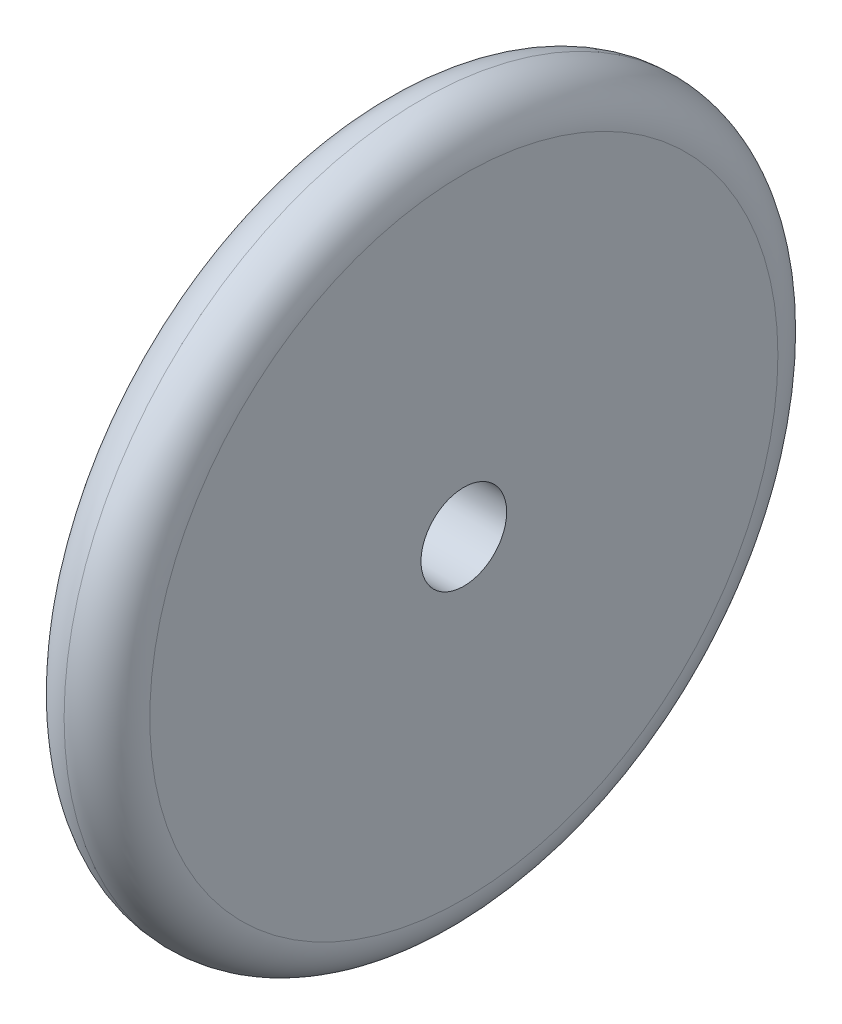
ISO-10303-21;
HEADER;
FILE_DESCRIPTION(('STEP AP214'),'2;1');
FILE_NAME('part.step','',(''),(''),'','','');
FILE_SCHEMA(('AUTOMOTIVE_DESIGN { 1 0 10303 214 1 1 1 1 }'));
ENDSEC;
DATA;
#1=APPLICATION_CONTEXT('core data for automotive mechanical design processes');
#2=APPLICATION_PROTOCOL_DEFINITION('international standard','automotive_design',2000,#1);
#3=PRODUCT_CONTEXT('',#1,'mechanical');
#4=PRODUCT('Part','Part','',(#3));
#5=PRODUCT_RELATED_PRODUCT_CATEGORY('part','',(#4));
#6=PRODUCT_DEFINITION_FORMATION('','',#4);
#7=PRODUCT_DEFINITION_CONTEXT('part definition',#1,'design');
#8=PRODUCT_DEFINITION('design','',#6,#7);
#9=PRODUCT_DEFINITION_SHAPE('','',#8);
#10=(LENGTH_UNIT() NAMED_UNIT(*) SI_UNIT(.MILLI.,.METRE.));
#11=(NAMED_UNIT(*) PLANE_ANGLE_UNIT() SI_UNIT($,.RADIAN.));
#12=(NAMED_UNIT(*) SI_UNIT($,.STERADIAN.) SOLID_ANGLE_UNIT());
#13=UNCERTAINTY_MEASURE_WITH_UNIT(LENGTH_MEASURE(1.E-05),#10,'distance_accuracy_value','');
#14=(GEOMETRIC_REPRESENTATION_CONTEXT(3) GLOBAL_UNCERTAINTY_ASSIGNED_CONTEXT((#13)) GLOBAL_UNIT_ASSIGNED_CONTEXT((#10,
#11,#12)) REPRESENTATION_CONTEXT('',''));
#15=CARTESIAN_POINT('',(0.,0.,0.));
#16=DIRECTION('',(0.,0.,1.));
#17=DIRECTION('',(1.,0.,0.));
#18=AXIS2_PLACEMENT_3D('',#15,#16,#17);
#19=CARTESIAN_POINT('',(30.,0.,0.));
#20=DIRECTION('',(1.,0.,0.));
#21=DIRECTION('',(0.,0.,-1.));
#22=AXIS2_PLACEMENT_3D('',#19,#20,#21);
#23=PLANE('',#22);
#24=CARTESIAN_POINT('',(30.,0.,0.));
#25=DIRECTION('',(1.,0.,0.));
#26=DIRECTION('',(0.,0.,-1.));
#27=AXIS2_PLACEMENT_3D('',#24,#25,#26);
#28=CIRCLE('',#27,15.);
#29=CARTESIAN_POINT('',(30.,0.,-15.));
#30=VERTEX_POINT('',#29);
#31=EDGE_CURVE('E53',#30,#30,#28,.T.);
#32=ORIENTED_EDGE('',*,*,#31,.F.);
#33=EDGE_LOOP('',(#32));
#34=FACE_BOUND('',#33,.T.);
#35=CARTESIAN_POINT('',(30.,0.,0.));
#36=DIRECTION('',(1.,0.,0.));
#37=DIRECTION('',(0.,0.,-1.));
#38=AXIS2_PLACEMENT_3D('',#35,#36,#37);
#39=CIRCLE('',#38,110.);
#40=CARTESIAN_POINT('',(30.,0.,-110.));
#41=VERTEX_POINT('',#40);
#42=EDGE_CURVE('E10',#41,#41,#39,.T.);
#43=ORIENTED_EDGE('',*,*,#42,.T.);
#44=EDGE_LOOP('',(#43));
#45=FACE_BOUND('',#44,.T.);
#46=ADVANCED_FACE('F37',(#34,#45),#23,.T.);
#47=CARTESIAN_POINT('',(0.,0.,0.));
#48=DIRECTION('',(1.,0.,0.));
#49=DIRECTION('',(0.,0.,-1.));
#50=AXIS2_PLACEMENT_3D('',#47,#48,#49);
#51=PLANE('',#50);
#52=CARTESIAN_POINT('',(0.,0.,0.));
#53=DIRECTION('',(1.,0.,0.));
#54=DIRECTION('',(0.,0.,-1.));
#55=AXIS2_PLACEMENT_3D('',#52,#53,#54);
#56=CIRCLE('',#55,15.);
#57=CARTESIAN_POINT('',(0.,0.,-15.));
#58=VERTEX_POINT('',#57);
#59=EDGE_CURVE('E57',#58,#58,#56,.T.);
#60=ORIENTED_EDGE('',*,*,#59,.T.);
#61=EDGE_LOOP('',(#60));
#62=FACE_BOUND('',#61,.T.);
#63=CARTESIAN_POINT('',(0.,0.,0.));
#64=DIRECTION('',(1.,0.,0.));
#65=DIRECTION('',(0.,0.,-1.));
#66=AXIS2_PLACEMENT_3D('',#63,#64,#65);
#67=CIRCLE('',#66,110.);
#68=CARTESIAN_POINT('',(0.,0.,-110.));
#69=VERTEX_POINT('',#68);
#70=EDGE_CURVE('E46',#69,#69,#67,.F.);
#71=ORIENTED_EDGE('',*,*,#70,.T.);
#72=EDGE_LOOP('',(#71));
#73=FACE_BOUND('',#72,.T.);
#74=ADVANCED_FACE('F69',(#62,#73),#51,.F.);
#75=CARTESIAN_POINT('',(15.,0.,0.));
#76=DIRECTION('',(1.,0.,0.));
#77=DIRECTION('',(0.,0.,-1.));
#78=AXIS2_PLACEMENT_3D('',#75,#76,#77);
#79=TOROIDAL_SURFACE('',#78,110.,15.);
#80=ORIENTED_EDGE('',*,*,#42,.F.);
#81=EDGE_LOOP('',(#80));
#82=FACE_BOUND('',#81,.T.);
#83=CARTESIAN_POINT('',(15.,0.,0.));
#84=DIRECTION('',(1.,0.,0.));
#85=DIRECTION('',(0.,0.,-1.));
#86=AXIS2_PLACEMENT_3D('',#83,#84,#85);
#87=CIRCLE('',#86,125.);
#88=CARTESIAN_POINT('',(15.,0.,-125.));
#89=VERTEX_POINT('',#88);
#90=EDGE_CURVE('E41',#89,#89,#87,.F.);
#91=ORIENTED_EDGE('',*,*,#90,.F.);
#92=EDGE_LOOP('',(#91));
#93=FACE_BOUND('',#92,.T.);
#94=ADVANCED_FACE('F39',(#82,#93),#79,.T.);
#95=CARTESIAN_POINT('',(15.,0.,0.));
#96=DIRECTION('',(1.,0.,0.));
#97=DIRECTION('',(0.,0.,-1.));
#98=AXIS2_PLACEMENT_3D('',#95,#96,#97);
#99=TOROIDAL_SURFACE('',#98,110.,15.);
#100=ORIENTED_EDGE('',*,*,#70,.F.);
#101=EDGE_LOOP('',(#100));
#102=FACE_BOUND('',#101,.T.);
#103=ORIENTED_EDGE('',*,*,#90,.T.);
#104=EDGE_LOOP('',(#103));
#105=FACE_BOUND('',#104,.T.);
#106=ADVANCED_FACE('F66',(#102,#105),#99,.T.);
#107=CARTESIAN_POINT('',(0.,0.,0.));
#108=DIRECTION('',(1.,0.,0.));
#109=DIRECTION('',(0.,0.,-1.));
#110=AXIS2_PLACEMENT_3D('',#107,#108,#109);
#111=CYLINDRICAL_SURFACE('',#110,15.);
#112=ORIENTED_EDGE('',*,*,#59,.F.);
#113=EDGE_LOOP('',(#112));
#114=FACE_BOUND('',#113,.T.);
#115=ORIENTED_EDGE('',*,*,#31,.T.);
#116=EDGE_LOOP('',(#115));
#117=FACE_BOUND('',#116,.T.);
#118=ADVANCED_FACE('F75',(#114,#117),#111,.F.);
#119=CLOSED_SHELL('',(#46,#74,#94,#106,#118));
#120=MANIFOLD_SOLID_BREP('B2',#119);
#121=ADVANCED_BREP_SHAPE_REPRESENTATION('',(#18,#120),#14);
#122=SHAPE_DEFINITION_REPRESENTATION(#9,#121);
ENDSEC;
END-ISO-10303-21;
